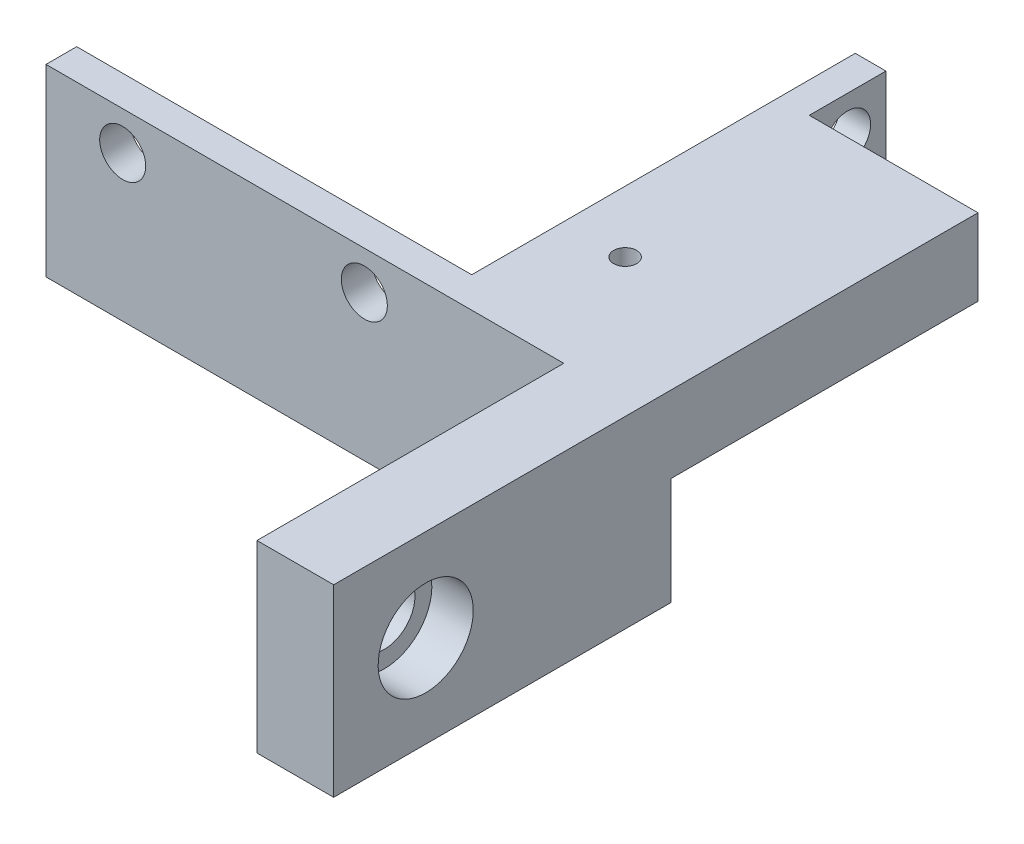
ISO-10303-21;
HEADER;
FILE_DESCRIPTION(('STEP AP214'),'2;1');
FILE_NAME('part.step','',(''),(''),'','','');
FILE_SCHEMA(('AUTOMOTIVE_DESIGN { 1 0 10303 214 1 1 1 1 }'));
ENDSEC;
DATA;
#1=APPLICATION_CONTEXT('core data for automotive mechanical design processes');
#2=APPLICATION_PROTOCOL_DEFINITION('international standard','automotive_design',2000,#1);
#3=PRODUCT_CONTEXT('',#1,'mechanical');
#4=PRODUCT('Part','Part','',(#3));
#5=PRODUCT_RELATED_PRODUCT_CATEGORY('part','',(#4));
#6=PRODUCT_DEFINITION_FORMATION('','',#4);
#7=PRODUCT_DEFINITION_CONTEXT('part definition',#1,'design');
#8=PRODUCT_DEFINITION('design','',#6,#7);
#9=PRODUCT_DEFINITION_SHAPE('','',#8);
#10=(LENGTH_UNIT() NAMED_UNIT(*) SI_UNIT(.MILLI.,.METRE.));
#11=(NAMED_UNIT(*) PLANE_ANGLE_UNIT() SI_UNIT($,.RADIAN.));
#12=(NAMED_UNIT(*) SI_UNIT($,.STERADIAN.) SOLID_ANGLE_UNIT());
#13=UNCERTAINTY_MEASURE_WITH_UNIT(LENGTH_MEASURE(1.E-05),#10,'distance_accuracy_value','');
#14=(GEOMETRIC_REPRESENTATION_CONTEXT(3) GLOBAL_UNCERTAINTY_ASSIGNED_CONTEXT((#13)) GLOBAL_UNIT_ASSIGNED_CONTEXT((#10,
#11,#12)) REPRESENTATION_CONTEXT('',''));
#15=CARTESIAN_POINT('',(0.,0.,0.));
#16=DIRECTION('',(0.,0.,1.));
#17=DIRECTION('',(1.,0.,0.));
#18=AXIS2_PLACEMENT_3D('',#15,#16,#17);
#19=CARTESIAN_POINT('',(-25.75,-0.999999999999987,14.));
#20=DIRECTION('',(1.,0.,0.));
#21=DIRECTION('',(0.,1.,0.));
#22=AXIS2_PLACEMENT_3D('',#19,#20,#21);
#23=CYLINDRICAL_SURFACE('',#22,2.);
#24=CARTESIAN_POINT('',(8.,-0.999999999999999,14.));
#25=DIRECTION('',(1.,0.,0.));
#26=DIRECTION('',(0.,0.,-1.));
#27=AXIS2_PLACEMENT_3D('',#24,#25,#26);
#28=CIRCLE('',#27,2.);
#29=CARTESIAN_POINT('',(8.,-0.999999999999999,12.));
#30=VERTEX_POINT('',#29);
#31=EDGE_CURVE('E201',#30,#30,#28,.T.);
#32=ORIENTED_EDGE('',*,*,#31,.F.);
#33=EDGE_LOOP('',(#32));
#34=FACE_BOUND('',#33,.T.);
#35=CARTESIAN_POINT('',(10.3,-1.,14.));
#36=DIRECTION('',(1.,0.,0.));
#37=DIRECTION('',(0.,1.,0.));
#38=AXIS2_PLACEMENT_3D('',#35,#36,#37);
#39=CIRCLE('',#38,2.);
#40=CARTESIAN_POINT('',(10.3,1.,14.));
#41=VERTEX_POINT('',#40);
#42=EDGE_CURVE('E181',#41,#41,#39,.F.);
#43=ORIENTED_EDGE('',*,*,#42,.F.);
#44=EDGE_LOOP('',(#43));
#45=FACE_BOUND('',#44,.T.);
#46=ADVANCED_FACE('F61',(#34,#45),#23,.F.);
#47=CARTESIAN_POINT('',(0.,0.,0.));
#48=DIRECTION('',(0.,1.,0.));
#49=DIRECTION('',(0.,0.,1.));
#50=AXIS2_PLACEMENT_3D('',#47,#48,#49);
#51=PLANE('',#50);
#52=CARTESIAN_POINT('',(4.,0.,-8.));
#53=DIRECTION('',(0.,1.,0.));
#54=DIRECTION('',(0.,0.,1.));
#55=AXIS2_PLACEMENT_3D('',#52,#53,#54);
#56=CIRCLE('',#55,0.750000000000001);
#57=CARTESIAN_POINT('',(4.,0.,-7.25));
#58=VERTEX_POINT('',#57);
#59=EDGE_CURVE('E259',#58,#58,#56,.T.);
#60=ORIENTED_EDGE('',*,*,#59,.T.);
#61=EDGE_LOOP('',(#60));
#62=FACE_BOUND('',#61,.T.);
#63=DIRECTION('',(1.,0.,0.));
#64=VECTOR('',#63,1.);
#65=CARTESIAN_POINT('',(-25.75,0.,-2.));
#66=LINE('',#65,#64);
#67=CARTESIAN_POINT('',(0.,0.,-2.));
#68=VERTEX_POINT('',#67);
#69=CARTESIAN_POINT('',(13.,0.,-2.));
#70=VERTEX_POINT('',#69);
#71=EDGE_CURVE('E12',#68,#70,#66,.T.);
#72=ORIENTED_EDGE('',*,*,#71,.F.);
#73=DIRECTION('',(0.,0.,1.));
#74=VECTOR('',#73,1.);
#75=CARTESIAN_POINT('',(0.,0.,-22.));
#76=LINE('',#75,#74);
#77=CARTESIAN_POINT('',(0.,0.,-27.));
#78=VERTEX_POINT('',#77);
#79=EDGE_CURVE('E221',#78,#68,#76,.T.);
#80=ORIENTED_EDGE('',*,*,#79,.F.);
#81=DIRECTION('',(-1.,0.,0.));
#82=VECTOR('',#81,1.);
#83=CARTESIAN_POINT('',(2.,0.,-27.));
#84=LINE('',#83,#82);
#85=CARTESIAN_POINT('',(2.,0.,-27.));
#86=VERTEX_POINT('',#85);
#87=EDGE_CURVE('E157',#86,#78,#84,.T.);
#88=ORIENTED_EDGE('',*,*,#87,.F.);
#89=DIRECTION('',(0.,0.,1.));
#90=VECTOR('',#89,1.);
#91=CARTESIAN_POINT('',(2.,0.,-22.));
#92=LINE('',#91,#90);
#93=CARTESIAN_POINT('',(2.,0.,-22.));
#94=VERTEX_POINT('',#93);
#95=EDGE_CURVE('E158',#86,#94,#92,.T.);
#96=ORIENTED_EDGE('',*,*,#95,.T.);
#97=DIRECTION('',(1.,0.,0.));
#98=VECTOR('',#97,1.);
#99=CARTESIAN_POINT('',(0.,0.,-22.));
#100=LINE('',#99,#98);
#101=CARTESIAN_POINT('',(13.,0.,-22.));
#102=VERTEX_POINT('',#101);
#103=EDGE_CURVE('E215',#94,#102,#100,.T.);
#104=ORIENTED_EDGE('',*,*,#103,.T.);
#105=DIRECTION('',(0.,0.,1.));
#106=VECTOR('',#105,1.);
#107=CARTESIAN_POINT('',(13.,0.,-22.));
#108=LINE('',#107,#106);
#109=EDGE_CURVE('E227',#102,#70,#108,.T.);
#110=ORIENTED_EDGE('',*,*,#109,.T.);
#111=EDGE_LOOP('',(#72,#80,#88,#96,#104,#110));
#112=FACE_BOUND('',#111,.T.);
#113=ADVANCED_FACE('F286',(#62,#112),#51,.F.);
#114=CARTESIAN_POINT('',(-25.75,5.,0.));
#115=DIRECTION('',(-1.,0.,0.));
#116=DIRECTION('',(0.,0.,1.));
#117=AXIS2_PLACEMENT_3D('',#114,#115,#116);
#118=PLANE('',#117);
#119=DIRECTION('',(0.,-1.,0.));
#120=VECTOR('',#119,1.);
#121=CARTESIAN_POINT('',(-25.75,5.,-2.));
#122=LINE('',#121,#120);
#123=CARTESIAN_POINT('',(-25.75,5.,-2.));
#124=VERTEX_POINT('',#123);
#125=CARTESIAN_POINT('',(-25.75,-7.,-2.));
#126=VERTEX_POINT('',#125);
#127=EDGE_CURVE('E237',#124,#126,#122,.T.);
#128=ORIENTED_EDGE('',*,*,#127,.T.);
#129=DIRECTION('',(0.,0.,-1.));
#130=VECTOR('',#129,1.);
#131=CARTESIAN_POINT('',(-25.75,-7.,0.));
#132=LINE('',#131,#130);
#133=CARTESIAN_POINT('',(-25.75,-7.,0.));
#134=VERTEX_POINT('',#133);
#135=EDGE_CURVE('E192',#134,#126,#132,.T.);
#136=ORIENTED_EDGE('',*,*,#135,.F.);
#137=DIRECTION('',(0.,-1.,0.));
#138=VECTOR('',#137,1.);
#139=CARTESIAN_POINT('',(-25.75,5.,0.));
#140=LINE('',#139,#138);
#141=CARTESIAN_POINT('',(-25.75,5.,0.));
#142=VERTEX_POINT('',#141);
#143=EDGE_CURVE('E70',#142,#134,#140,.T.);
#144=ORIENTED_EDGE('',*,*,#143,.F.);
#145=DIRECTION('',(0.,0.,-1.));
#146=VECTOR('',#145,1.);
#147=CARTESIAN_POINT('',(-25.75,5.,0.));
#148=LINE('',#147,#146);
#149=EDGE_CURVE('E224',#142,#124,#148,.T.);
#150=ORIENTED_EDGE('',*,*,#149,.T.);
#151=EDGE_LOOP('',(#128,#136,#144,#150));
#152=FACE_BOUND('',#151,.T.);
#153=ADVANCED_FACE('F63',(#152),#118,.T.);
#154=CARTESIAN_POINT('',(0.,5.,0.));
#155=DIRECTION('',(0.,0.,1.));
#156=DIRECTION('',(1.,0.,0.));
#157=AXIS2_PLACEMENT_3D('',#154,#155,#156);
#158=PLANE('',#157);
#159=CARTESIAN_POINT('',(-20.75,2.5,0.));
#160=DIRECTION('',(0.,0.,1.));
#161=DIRECTION('',(1.,0.,0.));
#162=AXIS2_PLACEMENT_3D('',#159,#160,#161);
#163=CIRCLE('',#162,1.5);
#164=CARTESIAN_POINT('',(-19.25,2.5,0.));
#165=VERTEX_POINT('',#164);
#166=EDGE_CURVE('E248',#165,#165,#163,.T.);
#167=ORIENTED_EDGE('',*,*,#166,.F.);
#168=EDGE_LOOP('',(#167));
#169=FACE_BOUND('',#168,.T.);
#170=CARTESIAN_POINT('',(-5.,2.5,0.));
#171=DIRECTION('',(0.,0.,1.));
#172=DIRECTION('',(1.,0.,0.));
#173=AXIS2_PLACEMENT_3D('',#170,#171,#172);
#174=CIRCLE('',#173,1.5);
#175=CARTESIAN_POINT('',(-3.5,2.5,0.));
#176=VERTEX_POINT('',#175);
#177=EDGE_CURVE('E254',#176,#176,#174,.T.);
#178=ORIENTED_EDGE('',*,*,#177,.F.);
#179=EDGE_LOOP('',(#178));
#180=FACE_BOUND('',#179,.T.);
#181=DIRECTION('',(0.,-1.,0.));
#182=VECTOR('',#181,1.);
#183=CARTESIAN_POINT('',(8.,0.,0.));
#184=LINE('',#183,#182);
#185=CARTESIAN_POINT('',(8.,5.,0.));
#186=VERTEX_POINT('',#185);
#187=CARTESIAN_POINT('',(8.,-7.,0.));
#188=VERTEX_POINT('',#187);
#189=EDGE_CURVE('E86',#186,#188,#184,.T.);
#190=ORIENTED_EDGE('',*,*,#189,.F.);
#191=DIRECTION('',(-1.,0.,0.));
#192=VECTOR('',#191,1.);
#193=CARTESIAN_POINT('',(0.,5.,0.));
#194=LINE('',#193,#192);
#195=EDGE_CURVE('E233',#186,#142,#194,.T.);
#196=ORIENTED_EDGE('',*,*,#195,.T.);
#197=ORIENTED_EDGE('',*,*,#143,.T.);
#198=DIRECTION('',(1.,0.,0.));
#199=VECTOR('',#198,1.);
#200=CARTESIAN_POINT('',(-25.75,-7.,0.));
#201=LINE('',#200,#199);
#202=EDGE_CURVE('E184',#134,#188,#201,.T.);
#203=ORIENTED_EDGE('',*,*,#202,.T.);
#204=EDGE_LOOP('',(#190,#196,#197,#203));
#205=FACE_BOUND('',#204,.T.);
#206=ADVANCED_FACE('F338',(#169,#180,#205),#158,.T.);
#207=CARTESIAN_POINT('',(0.,5.,-2.));
#208=DIRECTION('',(0.,0.,1.));
#209=DIRECTION('',(1.,0.,0.));
#210=AXIS2_PLACEMENT_3D('',#207,#208,#209);
#211=PLANE('',#210);
#212=CARTESIAN_POINT('',(-20.75,2.5,-2.));
#213=DIRECTION('',(0.,0.,1.));
#214=DIRECTION('',(1.,0.,0.));
#215=AXIS2_PLACEMENT_3D('',#212,#213,#214);
#216=CIRCLE('',#215,1.5);
#217=CARTESIAN_POINT('',(-19.25,2.5,-2.));
#218=VERTEX_POINT('',#217);
#219=EDGE_CURVE('E65',#218,#218,#216,.T.);
#220=ORIENTED_EDGE('',*,*,#219,.T.);
#221=EDGE_LOOP('',(#220));
#222=FACE_BOUND('',#221,.T.);
#223=CARTESIAN_POINT('',(-5.,2.5,-2.));
#224=DIRECTION('',(0.,0.,1.));
#225=DIRECTION('',(1.,0.,0.));
#226=AXIS2_PLACEMENT_3D('',#223,#224,#225);
#227=CIRCLE('',#226,1.5);
#228=CARTESIAN_POINT('',(-3.5,2.5,-2.));
#229=VERTEX_POINT('',#228);
#230=EDGE_CURVE('E246',#229,#229,#227,.T.);
#231=ORIENTED_EDGE('',*,*,#230,.T.);
#232=EDGE_LOOP('',(#231));
#233=FACE_BOUND('',#232,.T.);
#234=DIRECTION('',(0.,-1.,0.));
#235=VECTOR('',#234,1.);
#236=CARTESIAN_POINT('',(0.,5.,-2.));
#237=LINE('',#236,#235);
#238=CARTESIAN_POINT('',(0.,5.,-2.));
#239=VERTEX_POINT('',#238);
#240=EDGE_CURVE('E239',#239,#68,#237,.T.);
#241=ORIENTED_EDGE('',*,*,#240,.T.);
#242=ORIENTED_EDGE('',*,*,#71,.T.);
#243=DIRECTION('',(0.,1.,0.));
#244=VECTOR('',#243,1.);
#245=CARTESIAN_POINT('',(13.,-7.,-2.));
#246=LINE('',#245,#244);
#247=CARTESIAN_POINT('',(13.,-7.,-2.));
#248=VERTEX_POINT('',#247);
#249=EDGE_CURVE('E194',#248,#70,#246,.T.);
#250=ORIENTED_EDGE('',*,*,#249,.F.);
#251=DIRECTION('',(1.,0.,0.));
#252=VECTOR('',#251,1.);
#253=CARTESIAN_POINT('',(-25.75,-7.,-2.));
#254=LINE('',#253,#252);
#255=EDGE_CURVE('E190',#126,#248,#254,.T.);
#256=ORIENTED_EDGE('',*,*,#255,.F.);
#257=ORIENTED_EDGE('',*,*,#127,.F.);
#258=DIRECTION('',(-1.,0.,0.));
#259=VECTOR('',#258,1.);
#260=CARTESIAN_POINT('',(0.,5.,-2.));
#261=LINE('',#260,#259);
#262=EDGE_CURVE('E235',#239,#124,#261,.T.);
#263=ORIENTED_EDGE('',*,*,#262,.F.);
#264=EDGE_LOOP('',(#241,#242,#250,#256,#257,#263));
#265=FACE_BOUND('',#264,.T.);
#266=ADVANCED_FACE('F282',(#222,#233,#265),#211,.F.);
#267=CARTESIAN_POINT('',(0.,5.,0.));
#268=DIRECTION('',(0.,1.,0.));
#269=DIRECTION('',(0.,0.,1.));
#270=AXIS2_PLACEMENT_3D('',#267,#268,#269);
#271=PLANE('',#270);
#272=CARTESIAN_POINT('',(4.,5.,-8.));
#273=DIRECTION('',(0.,1.,0.));
#274=DIRECTION('',(0.,0.,1.));
#275=AXIS2_PLACEMENT_3D('',#272,#273,#274);
#276=CIRCLE('',#275,0.750000000000001);
#277=CARTESIAN_POINT('',(4.,5.,-7.25));
#278=VERTEX_POINT('',#277);
#279=EDGE_CURVE('E448',#278,#278,#276,.T.);
#280=ORIENTED_EDGE('',*,*,#279,.F.);
#281=EDGE_LOOP('',(#280));
#282=FACE_BOUND('',#281,.T.);
#283=ORIENTED_EDGE('',*,*,#149,.F.);
#284=ORIENTED_EDGE('',*,*,#195,.F.);
#285=DIRECTION('',(0.,0.,-1.));
#286=VECTOR('',#285,1.);
#287=CARTESIAN_POINT('',(8.,5.,20.));
#288=LINE('',#287,#286);
#289=CARTESIAN_POINT('',(8.,5.,20.));
#290=VERTEX_POINT('',#289);
#291=EDGE_CURVE('E211',#290,#186,#288,.T.);
#292=ORIENTED_EDGE('',*,*,#291,.F.);
#293=DIRECTION('',(1.,0.,0.));
#294=VECTOR('',#293,1.);
#295=CARTESIAN_POINT('',(0.,5.,20.));
#296=LINE('',#295,#294);
#297=CARTESIAN_POINT('',(13.,5.,20.));
#298=VERTEX_POINT('',#297);
#299=EDGE_CURVE('E204',#290,#298,#296,.T.);
#300=ORIENTED_EDGE('',*,*,#299,.T.);
#301=DIRECTION('',(0.,0.,1.));
#302=VECTOR('',#301,1.);
#303=CARTESIAN_POINT('',(13.,5.,-22.));
#304=LINE('',#303,#302);
#305=CARTESIAN_POINT('',(13.,5.,-22.));
#306=VERTEX_POINT('',#305);
#307=EDGE_CURVE('E225',#306,#298,#304,.T.);
#308=ORIENTED_EDGE('',*,*,#307,.F.);
#309=DIRECTION('',(1.,0.,0.));
#310=VECTOR('',#309,1.);
#311=CARTESIAN_POINT('',(0.,5.,-22.));
#312=LINE('',#311,#310);
#313=CARTESIAN_POINT('',(2.,5.,-22.));
#314=VERTEX_POINT('',#313);
#315=EDGE_CURVE('E167',#314,#306,#312,.T.);
#316=ORIENTED_EDGE('',*,*,#315,.F.);
#317=DIRECTION('',(0.,0.,-1.));
#318=VECTOR('',#317,1.);
#319=CARTESIAN_POINT('',(2.,5.,-22.));
#320=LINE('',#319,#318);
#321=CARTESIAN_POINT('',(2.,5.,-27.));
#322=VERTEX_POINT('',#321);
#323=EDGE_CURVE('E78',#314,#322,#320,.T.);
#324=ORIENTED_EDGE('',*,*,#323,.T.);
#325=DIRECTION('',(-1.,0.,0.));
#326=VECTOR('',#325,1.);
#327=CARTESIAN_POINT('',(2.,5.,-27.));
#328=LINE('',#327,#326);
#329=CARTESIAN_POINT('',(0.,5.,-27.));
#330=VERTEX_POINT('',#329);
#331=EDGE_CURVE('E148',#322,#330,#328,.T.);
#332=ORIENTED_EDGE('',*,*,#331,.T.);
#333=DIRECTION('',(0.,0.,1.));
#334=VECTOR('',#333,1.);
#335=CARTESIAN_POINT('',(0.,5.,-22.));
#336=LINE('',#335,#334);
#337=EDGE_CURVE('E222',#330,#239,#336,.T.);
#338=ORIENTED_EDGE('',*,*,#337,.T.);
#339=ORIENTED_EDGE('',*,*,#262,.T.);
#340=EDGE_LOOP('',(#283,#284,#292,#300,#308,#316,#324,#332,#338,#339));
#341=FACE_BOUND('',#340,.T.);
#342=ADVANCED_FACE('F165',(#282,#341),#271,.T.);
#343=CARTESIAN_POINT('',(0.,5.,-22.));
#344=DIRECTION('',(-1.,0.,0.));
#345=DIRECTION('',(0.,-1.,0.));
#346=AXIS2_PLACEMENT_3D('',#343,#344,#345);
#347=PLANE('',#346);
#348=ORIENTED_EDGE('',*,*,#240,.F.);
#349=ORIENTED_EDGE('',*,*,#337,.F.);
#350=DIRECTION('',(0.,-1.,0.));
#351=VECTOR('',#350,1.);
#352=CARTESIAN_POINT('',(0.,5.,-27.));
#353=LINE('',#352,#351);
#354=EDGE_CURVE('E154',#330,#78,#353,.T.);
#355=ORIENTED_EDGE('',*,*,#354,.T.);
#356=ORIENTED_EDGE('',*,*,#79,.T.);
#357=EDGE_LOOP('',(#348,#349,#355,#356));
#358=FACE_BOUND('',#357,.T.);
#359=CARTESIAN_POINT('',(0.,2.5,-24.5));
#360=DIRECTION('',(-1.,0.,0.));
#361=DIRECTION('',(0.,-1.,0.));
#362=AXIS2_PLACEMENT_3D('',#359,#360,#361);
#363=CIRCLE('',#362,1.5);
#364=CARTESIAN_POINT('',(0.,0.999999999999999,-24.5));
#365=VERTEX_POINT('',#364);
#366=EDGE_CURVE('E252',#365,#365,#363,.T.);
#367=ORIENTED_EDGE('',*,*,#366,.F.);
#368=EDGE_LOOP('',(#367));
#369=FACE_BOUND('',#368,.T.);
#370=ADVANCED_FACE('F270',(#358,#369),#347,.T.);
#371=CARTESIAN_POINT('',(13.,5.,-22.));
#372=DIRECTION('',(-1.,0.,0.));
#373=DIRECTION('',(0.,0.,1.));
#374=AXIS2_PLACEMENT_3D('',#371,#372,#373);
#375=PLANE('',#374);
#376=CARTESIAN_POINT('',(13.,-1.,14.));
#377=DIRECTION('',(1.,0.,0.));
#378=DIRECTION('',(0.,1.,0.));
#379=AXIS2_PLACEMENT_3D('',#376,#377,#378);
#380=CIRCLE('',#379,3.1);
#381=CARTESIAN_POINT('',(13.,2.1,14.));
#382=VERTEX_POINT('',#381);
#383=EDGE_CURVE('E176',#382,#382,#380,.T.);
#384=ORIENTED_EDGE('',*,*,#383,.F.);
#385=EDGE_LOOP('',(#384));
#386=FACE_BOUND('',#385,.T.);
#387=ORIENTED_EDGE('',*,*,#307,.T.);
#388=DIRECTION('',(0.,-1.,0.));
#389=VECTOR('',#388,1.);
#390=CARTESIAN_POINT('',(13.,0.,20.));
#391=LINE('',#390,#389);
#392=CARTESIAN_POINT('',(13.,-7.,20.));
#393=VERTEX_POINT('',#392);
#394=EDGE_CURVE('E209',#298,#393,#391,.T.);
#395=ORIENTED_EDGE('',*,*,#394,.T.);
#396=DIRECTION('',(0.,0.,-1.));
#397=VECTOR('',#396,1.);
#398=CARTESIAN_POINT('',(13.,-7.,0.));
#399=LINE('',#398,#397);
#400=EDGE_CURVE('E186',#393,#248,#399,.T.);
#401=ORIENTED_EDGE('',*,*,#400,.T.);
#402=ORIENTED_EDGE('',*,*,#249,.T.);
#403=ORIENTED_EDGE('',*,*,#109,.F.);
#404=DIRECTION('',(0.,-1.,0.));
#405=VECTOR('',#404,1.);
#406=CARTESIAN_POINT('',(13.,5.,-22.));
#407=LINE('',#406,#405);
#408=EDGE_CURVE('E217',#306,#102,#407,.T.);
#409=ORIENTED_EDGE('',*,*,#408,.F.);
#410=EDGE_LOOP('',(#387,#395,#401,#402,#403,#409));
#411=FACE_BOUND('',#410,.T.);
#412=ADVANCED_FACE('F272',(#386,#411),#375,.F.);
#413=CARTESIAN_POINT('',(0.,0.,-22.));
#414=DIRECTION('',(0.,0.,1.));
#415=DIRECTION('',(1.,0.,0.));
#416=AXIS2_PLACEMENT_3D('',#413,#414,#415);
#417=PLANE('',#416);
#418=ORIENTED_EDGE('',*,*,#103,.F.);
#419=DIRECTION('',(0.,1.,0.));
#420=VECTOR('',#419,1.);
#421=CARTESIAN_POINT('',(2.,5.,-22.));
#422=LINE('',#421,#420);
#423=EDGE_CURVE('E168',#94,#314,#422,.T.);
#424=ORIENTED_EDGE('',*,*,#423,.T.);
#425=ORIENTED_EDGE('',*,*,#315,.T.);
#426=ORIENTED_EDGE('',*,*,#408,.T.);
#427=EDGE_LOOP('',(#418,#424,#425,#426));
#428=FACE_BOUND('',#427,.T.);
#429=ADVANCED_FACE('F279',(#428),#417,.F.);
#430=CARTESIAN_POINT('',(8.,0.,20.));
#431=DIRECTION('',(1.,0.,0.));
#432=DIRECTION('',(0.,0.,-1.));
#433=AXIS2_PLACEMENT_3D('',#430,#431,#432);
#434=PLANE('',#433);
#435=ORIENTED_EDGE('',*,*,#31,.T.);
#436=EDGE_LOOP('',(#435));
#437=FACE_BOUND('',#436,.T.);
#438=ORIENTED_EDGE('',*,*,#189,.T.);
#439=DIRECTION('',(0.,0.,1.));
#440=VECTOR('',#439,1.);
#441=CARTESIAN_POINT('',(8.,-7.,0.));
#442=LINE('',#441,#440);
#443=CARTESIAN_POINT('',(8.,-7.,20.));
#444=VERTEX_POINT('',#443);
#445=EDGE_CURVE('E187',#188,#444,#442,.T.);
#446=ORIENTED_EDGE('',*,*,#445,.T.);
#447=DIRECTION('',(0.,-1.,0.));
#448=VECTOR('',#447,1.);
#449=CARTESIAN_POINT('',(8.,0.,20.));
#450=LINE('',#449,#448);
#451=EDGE_CURVE('E207',#290,#444,#450,.T.);
#452=ORIENTED_EDGE('',*,*,#451,.F.);
#453=ORIENTED_EDGE('',*,*,#291,.T.);
#454=EDGE_LOOP('',(#438,#446,#452,#453));
#455=FACE_BOUND('',#454,.T.);
#456=ADVANCED_FACE('F308',(#437,#455),#434,.F.);
#457=CARTESIAN_POINT('',(0.,0.,20.));
#458=DIRECTION('',(0.,0.,1.));
#459=DIRECTION('',(1.,0.,0.));
#460=AXIS2_PLACEMENT_3D('',#457,#458,#459);
#461=PLANE('',#460);
#462=ORIENTED_EDGE('',*,*,#299,.F.);
#463=ORIENTED_EDGE('',*,*,#451,.T.);
#464=DIRECTION('',(-1.,0.,0.));
#465=VECTOR('',#464,1.);
#466=CARTESIAN_POINT('',(13.,-7.,20.));
#467=LINE('',#466,#465);
#468=EDGE_CURVE('E198',#393,#444,#467,.T.);
#469=ORIENTED_EDGE('',*,*,#468,.F.);
#470=ORIENTED_EDGE('',*,*,#394,.F.);
#471=EDGE_LOOP('',(#462,#463,#469,#470));
#472=FACE_BOUND('',#471,.T.);
#473=ADVANCED_FACE('F304',(#472),#461,.T.);
#474=CARTESIAN_POINT('',(0.,-7.,0.));
#475=DIRECTION('',(0.,1.,0.));
#476=DIRECTION('',(0.,0.,1.));
#477=AXIS2_PLACEMENT_3D('',#474,#475,#476);
#478=PLANE('',#477);
#479=ORIENTED_EDGE('',*,*,#202,.F.);
#480=ORIENTED_EDGE('',*,*,#135,.T.);
#481=ORIENTED_EDGE('',*,*,#255,.T.);
#482=ORIENTED_EDGE('',*,*,#400,.F.);
#483=ORIENTED_EDGE('',*,*,#468,.T.);
#484=ORIENTED_EDGE('',*,*,#445,.F.);
#485=EDGE_LOOP('',(#479,#480,#481,#482,#483,#484));
#486=FACE_BOUND('',#485,.T.);
#487=ADVANCED_FACE('F300',(#486),#478,.F.);
#488=CARTESIAN_POINT('',(10.3,-1.,14.));
#489=DIRECTION('',(1.,0.,0.));
#490=DIRECTION('',(0.,1.,0.));
#491=AXIS2_PLACEMENT_3D('',#488,#489,#490);
#492=PLANE('',#491);
#493=CARTESIAN_POINT('',(10.3,-1.,14.));
#494=DIRECTION('',(1.,0.,0.));
#495=DIRECTION('',(0.,1.,0.));
#496=AXIS2_PLACEMENT_3D('',#493,#494,#495);
#497=CIRCLE('',#496,3.1);
#498=CARTESIAN_POINT('',(10.3,2.1,14.));
#499=VERTEX_POINT('',#498);
#500=EDGE_CURVE('E178',#499,#499,#497,.T.);
#501=ORIENTED_EDGE('',*,*,#500,.T.);
#502=EDGE_LOOP('',(#501));
#503=FACE_BOUND('',#502,.T.);
#504=ORIENTED_EDGE('',*,*,#42,.T.);
#505=EDGE_LOOP('',(#504));
#506=FACE_BOUND('',#505,.T.);
#507=ADVANCED_FACE('F303',(#503,#506),#492,.T.);
#508=CARTESIAN_POINT('',(10.3,-1.,14.));
#509=DIRECTION('',(1.,0.,0.));
#510=DIRECTION('',(0.,1.,0.));
#511=AXIS2_PLACEMENT_3D('',#508,#509,#510);
#512=CYLINDRICAL_SURFACE('',#511,3.1);
#513=CARTESIAN_POINT('',(10.3,2.1,14.));
#514=CARTESIAN_POINT('',(10.328125,2.1,14.));
#515=CARTESIAN_POINT('',(10.35625,2.1,14.));
#516=CARTESIAN_POINT('',(10.4125,2.1,14.));
#517=CARTESIAN_POINT('',(10.440625,2.1,14.));
#518=CARTESIAN_POINT('',(10.496875,2.1,14.));
#519=CARTESIAN_POINT('',(10.525,2.1,14.));
#520=CARTESIAN_POINT('',(10.58125,2.1,14.));
#521=CARTESIAN_POINT('',(10.609375,2.1,14.));
#522=CARTESIAN_POINT('',(10.665625,2.1,14.));
#523=CARTESIAN_POINT('',(10.69375,2.1,14.));
#524=CARTESIAN_POINT('',(10.75,2.1,14.));
#525=CARTESIAN_POINT('',(10.778125,2.1,14.));
#526=CARTESIAN_POINT('',(10.834375,2.1,14.));
#527=CARTESIAN_POINT('',(10.8625,2.1,14.));
#528=CARTESIAN_POINT('',(10.91875,2.1,14.));
#529=CARTESIAN_POINT('',(10.946875,2.1,14.));
#530=CARTESIAN_POINT('',(11.003125,2.1,14.));
#531=CARTESIAN_POINT('',(11.03125,2.1,14.));
#532=CARTESIAN_POINT('',(11.0875,2.1,14.));
#533=CARTESIAN_POINT('',(11.115625,2.1,14.));
#534=CARTESIAN_POINT('',(11.171875,2.1,14.));
#535=CARTESIAN_POINT('',(11.2,2.1,14.));
#536=CARTESIAN_POINT('',(11.25625,2.1,14.));
#537=CARTESIAN_POINT('',(11.284375,2.1,14.));
#538=CARTESIAN_POINT('',(11.340625,2.1,14.));
#539=CARTESIAN_POINT('',(11.36875,2.1,14.));
#540=CARTESIAN_POINT('',(11.425,2.1,14.));
#541=CARTESIAN_POINT('',(11.453125,2.1,14.));
#542=CARTESIAN_POINT('',(11.509375,2.1,14.));
#543=CARTESIAN_POINT('',(11.5375,2.1,14.));
#544=CARTESIAN_POINT('',(11.59375,2.1,14.));
#545=CARTESIAN_POINT('',(11.621875,2.1,14.));
#546=CARTESIAN_POINT('',(11.678125,2.1,14.));
#547=CARTESIAN_POINT('',(11.70625,2.1,14.));
#548=CARTESIAN_POINT('',(11.7625,2.1,14.));
#549=CARTESIAN_POINT('',(11.790625,2.1,14.));
#550=CARTESIAN_POINT('',(11.846875,2.1,14.));
#551=CARTESIAN_POINT('',(11.875,2.1,14.));
#552=CARTESIAN_POINT('',(11.93125,2.1,14.));
#553=CARTESIAN_POINT('',(11.959375,2.1,14.));
#554=CARTESIAN_POINT('',(12.015625,2.1,14.));
#555=CARTESIAN_POINT('',(12.04375,2.1,14.));
#556=CARTESIAN_POINT('',(12.1,2.1,14.));
#557=CARTESIAN_POINT('',(12.128125,2.1,14.));
#558=CARTESIAN_POINT('',(12.184375,2.1,14.));
#559=CARTESIAN_POINT('',(12.2125,2.1,14.));
#560=CARTESIAN_POINT('',(12.26875,2.1,14.));
#561=CARTESIAN_POINT('',(12.296875,2.1,14.));
#562=CARTESIAN_POINT('',(12.353125,2.1,14.));
#563=CARTESIAN_POINT('',(12.38125,2.1,14.));
#564=CARTESIAN_POINT('',(12.4375,2.1,14.));
#565=CARTESIAN_POINT('',(12.465625,2.1,14.));
#566=CARTESIAN_POINT('',(12.521875,2.1,14.));
#567=CARTESIAN_POINT('',(12.55,2.1,14.));
#568=CARTESIAN_POINT('',(12.60625,2.1,14.));
#569=CARTESIAN_POINT('',(12.634375,2.1,14.));
#570=CARTESIAN_POINT('',(12.690625,2.1,14.));
#571=CARTESIAN_POINT('',(12.71875,2.1,14.));
#572=CARTESIAN_POINT('',(12.775,2.1,14.));
#573=CARTESIAN_POINT('',(12.803125,2.1,14.));
#574=CARTESIAN_POINT('',(12.859375,2.1,14.));
#575=CARTESIAN_POINT('',(12.8875,2.1,14.));
#576=CARTESIAN_POINT('',(12.94375,2.1,14.));
#577=CARTESIAN_POINT('',(12.971875,2.1,14.));
#578=CARTESIAN_POINT('',(13.,2.1,14.));
#579=B_SPLINE_CURVE_WITH_KNOTS('',3,(#513,#514,#515,#516,#517,#518,#519,#520,#521,#522,#523,
#524,#525,#526,#527,#528,#529,#530,#531,#532,#533,#534,#535,#536,#537,#538,#539,#540,#541,#542,
#543,#544,#545,#546,#547,#548,#549,#550,#551,#552,#553,#554,#555,#556,#557,#558,#559,#560,#561,
#562,#563,#564,#565,#566,#567,#568,#569,#570,#571,#572,#573,#574,#575,#576,#577,#578),
.UNSPECIFIED.,.F.,.F.,(4,2,2,2,2,2,2,2,2,2,2,2,2,2,2,2,2,2,2,2,2,2,2,2,2,2,2,2,2,2,2,2,4),(0.,
0.0843750000000011,0.168750000000001,0.253125,0.337500000000001,0.421875,0.50625,
0.590625000000001,0.675,0.759375000000001,0.843750000000001,0.928125,1.0125,1.096875,1.18125,
1.265625,1.35,1.434375,1.51875,1.603125,1.6875,1.771875,1.85625,1.940625,2.025,2.109375,2.19375,
2.278125,2.3625,2.446875,2.53125,2.615625,2.7),.UNSPECIFIED.);
#580=EDGE_CURVE('BSEAM298',#499,#382,#579,.T.);
#581=ORIENTED_EDGE('',*,*,#500,.F.);
#582=ORIENTED_EDGE('',*,*,#383,.T.);
#583=ORIENTED_EDGE('',*,*,#580,.T.);
#584=ORIENTED_EDGE('',*,*,#580,.F.);
#585=EDGE_LOOP('',(#581,#583,#582,#584));
#586=FACE_BOUND('',#585,.T.);
#587=ADVANCED_FACE('F298',(#586),#512,.F.);
#588=CARTESIAN_POINT('',(2.,5.,-27.));
#589=DIRECTION('',(0.,0.,-1.));
#590=DIRECTION('',(-1.,0.,0.));
#591=AXIS2_PLACEMENT_3D('',#588,#589,#590);
#592=PLANE('',#591);
#593=ORIENTED_EDGE('',*,*,#354,.F.);
#594=ORIENTED_EDGE('',*,*,#331,.F.);
#595=DIRECTION('',(0.,-1.,0.));
#596=VECTOR('',#595,1.);
#597=CARTESIAN_POINT('',(2.,5.,-27.));
#598=LINE('',#597,#596);
#599=EDGE_CURVE('E151',#322,#86,#598,.T.);
#600=ORIENTED_EDGE('',*,*,#599,.T.);
#601=ORIENTED_EDGE('',*,*,#87,.T.);
#602=EDGE_LOOP('',(#593,#594,#600,#601));
#603=FACE_BOUND('',#602,.T.);
#604=ADVANCED_FACE('F149',(#603),#592,.T.);
#605=CARTESIAN_POINT('',(2.,0.,0.));
#606=DIRECTION('',(1.,0.,0.));
#607=DIRECTION('',(0.,1.,0.));
#608=AXIS2_PLACEMENT_3D('',#605,#606,#607);
#609=PLANE('',#608);
#610=CARTESIAN_POINT('',(2.,2.5,-24.5));
#611=DIRECTION('',(-1.,0.,0.));
#612=DIRECTION('',(0.,-1.,0.));
#613=AXIS2_PLACEMENT_3D('',#610,#611,#612);
#614=CIRCLE('',#613,1.5);
#615=CARTESIAN_POINT('',(2.,0.999999999999999,-24.5));
#616=VERTEX_POINT('',#615);
#617=EDGE_CURVE('E175',#616,#616,#614,.T.);
#618=ORIENTED_EDGE('',*,*,#617,.T.);
#619=EDGE_LOOP('',(#618));
#620=FACE_BOUND('',#619,.T.);
#621=ORIENTED_EDGE('',*,*,#423,.F.);
#622=ORIENTED_EDGE('',*,*,#95,.F.);
#623=ORIENTED_EDGE('',*,*,#599,.F.);
#624=ORIENTED_EDGE('',*,*,#323,.F.);
#625=EDGE_LOOP('',(#621,#622,#623,#624));
#626=FACE_BOUND('',#625,.T.);
#627=ADVANCED_FACE('F160',(#620,#626),#609,.T.);
#628=CARTESIAN_POINT('',(2.,2.5,-24.5));
#629=DIRECTION('',(-1.,0.,0.));
#630=DIRECTION('',(0.,-1.,0.));
#631=AXIS2_PLACEMENT_3D('',#628,#629,#630);
#632=CYLINDRICAL_SURFACE('',#631,1.5);
#633=ORIENTED_EDGE('',*,*,#617,.F.);
#634=EDGE_LOOP('',(#633));
#635=FACE_BOUND('',#634,.T.);
#636=ORIENTED_EDGE('',*,*,#366,.T.);
#637=EDGE_LOOP('',(#636));
#638=FACE_BOUND('',#637,.T.);
#639=ADVANCED_FACE('F268',(#635,#638),#632,.F.);
#640=CARTESIAN_POINT('',(-5.,2.5,-27.));
#641=DIRECTION('',(0.,0.,1.));
#642=DIRECTION('',(1.,0.,0.));
#643=AXIS2_PLACEMENT_3D('',#640,#641,#642);
#644=CYLINDRICAL_SURFACE('',#643,1.5);
#645=ORIENTED_EDGE('',*,*,#177,.T.);
#646=EDGE_LOOP('',(#645));
#647=FACE_BOUND('',#646,.T.);
#648=ORIENTED_EDGE('',*,*,#230,.F.);
#649=EDGE_LOOP('',(#648));
#650=FACE_BOUND('',#649,.T.);
#651=ADVANCED_FACE('F350',(#647,#650),#644,.F.);
#652=CARTESIAN_POINT('',(-20.75,2.5,-27.));
#653=DIRECTION('',(0.,0.,1.));
#654=DIRECTION('',(1.,0.,0.));
#655=AXIS2_PLACEMENT_3D('',#652,#653,#654);
#656=CYLINDRICAL_SURFACE('',#655,1.5);
#657=ORIENTED_EDGE('',*,*,#166,.T.);
#658=EDGE_LOOP('',(#657));
#659=FACE_BOUND('',#658,.T.);
#660=ORIENTED_EDGE('',*,*,#219,.F.);
#661=EDGE_LOOP('',(#660));
#662=FACE_BOUND('',#661,.T.);
#663=ADVANCED_FACE('F353',(#659,#662),#656,.F.);
#664=CARTESIAN_POINT('',(4.,-7.,-8.));
#665=DIRECTION('',(0.,1.,0.));
#666=DIRECTION('',(0.,0.,1.));
#667=AXIS2_PLACEMENT_3D('',#664,#665,#666);
#668=CYLINDRICAL_SURFACE('',#667,0.750000000000001);
#669=ORIENTED_EDGE('',*,*,#279,.T.);
#670=EDGE_LOOP('',(#669));
#671=FACE_BOUND('',#670,.T.);
#672=ORIENTED_EDGE('',*,*,#59,.F.);
#673=EDGE_LOOP('',(#672));
#674=FACE_BOUND('',#673,.T.);
#675=ADVANCED_FACE('F359',(#671,#674),#668,.F.);
#676=CLOSED_SHELL('',(#46,#113,#153,#206,#266,#342,#370,#412,#429,#456,#473,#487,#507,#587,#604,
#627,#639,#651,#663,#675));
#677=MANIFOLD_SOLID_BREP('B2',#676);
#678=ADVANCED_BREP_SHAPE_REPRESENTATION('',(#18,#677),#14);
#679=SHAPE_DEFINITION_REPRESENTATION(#9,#678);
ENDSEC;
END-ISO-10303-21;
